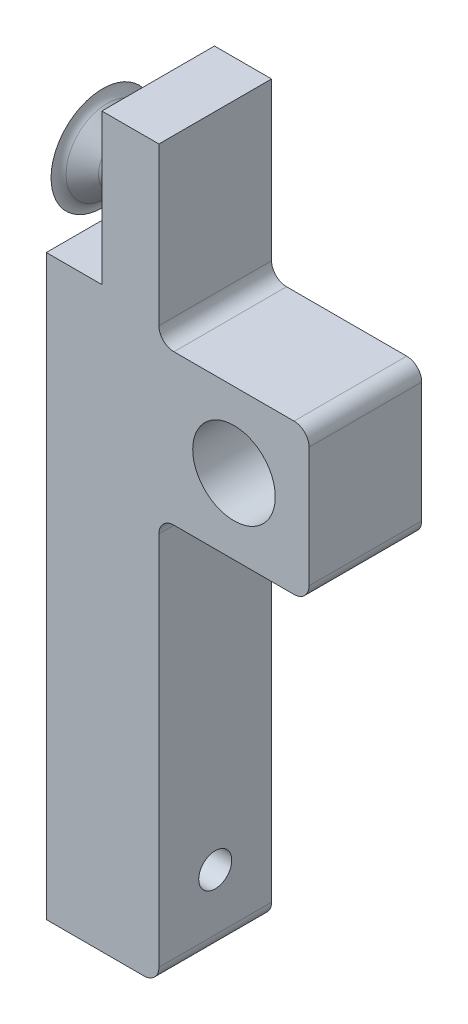
ISO-10303-21;
HEADER;
FILE_DESCRIPTION(('STEP AP214'),'2;1');
FILE_NAME('part.step','',(''),(''),'','','');
FILE_SCHEMA(('AUTOMOTIVE_DESIGN { 1 0 10303 214 1 1 1 1 }'));
ENDSEC;
DATA;
#1=APPLICATION_CONTEXT('core data for automotive mechanical design processes');
#2=APPLICATION_PROTOCOL_DEFINITION('international standard','automotive_design',2000,#1);
#3=PRODUCT_CONTEXT('',#1,'mechanical');
#4=PRODUCT('Part','Part','',(#3));
#5=PRODUCT_RELATED_PRODUCT_CATEGORY('part','',(#4));
#6=PRODUCT_DEFINITION_FORMATION('','',#4);
#7=PRODUCT_DEFINITION_CONTEXT('part definition',#1,'design');
#8=PRODUCT_DEFINITION('design','',#6,#7);
#9=PRODUCT_DEFINITION_SHAPE('','',#8);
#10=(LENGTH_UNIT() NAMED_UNIT(*) SI_UNIT(.MILLI.,.METRE.));
#11=(NAMED_UNIT(*) PLANE_ANGLE_UNIT() SI_UNIT($,.RADIAN.));
#12=(NAMED_UNIT(*) SI_UNIT($,.STERADIAN.) SOLID_ANGLE_UNIT());
#13=UNCERTAINTY_MEASURE_WITH_UNIT(LENGTH_MEASURE(1.E-05),#10,'distance_accuracy_value','');
#14=(GEOMETRIC_REPRESENTATION_CONTEXT(3) GLOBAL_UNCERTAINTY_ASSIGNED_CONTEXT((#13)) GLOBAL_UNIT_ASSIGNED_CONTEXT((#10,
#11,#12)) REPRESENTATION_CONTEXT('',''));
#15=CARTESIAN_POINT('',(0.,0.,0.));
#16=DIRECTION('',(0.,0.,1.));
#17=DIRECTION('',(1.,0.,0.));
#18=AXIS2_PLACEMENT_3D('',#15,#16,#17);
#19=CARTESIAN_POINT('',(-30.0873000000014,-185.773249337691,0.));
#20=DIRECTION('',(0.,1.,0.));
#21=DIRECTION('',(-1.,0.,0.));
#22=AXIS2_PLACEMENT_3D('',#19,#20,#21);
#23=PLANE('',#22);
#24=DIRECTION('',(-1.,0.,0.));
#25=VECTOR('',#24,1.);
#26=CARTESIAN_POINT('',(-30.0873000000014,-185.773249337691,-140.610099631724));
#27=LINE('',#26,#25);
#28=CARTESIAN_POINT('',(-32.6273000000014,-185.773249337691,-140.610099631724));
#29=VERTEX_POINT('',#28);
#30=CARTESIAN_POINT('',(-52.9473000000008,-185.773249337691,-140.610099631724));
#31=VERTEX_POINT('',#30);
#32=EDGE_CURVE('E272',#29,#31,#27,.T.);
#33=ORIENTED_EDGE('',*,*,#32,.T.);
#34=DIRECTION('',(0.,0.,-1.));
#35=VECTOR('',#34,1.);
#36=CARTESIAN_POINT('',(-52.9473000000008,-185.773249337691,0.));
#37=LINE('',#36,#35);
#38=CARTESIAN_POINT('',(-52.9473000000008,-185.773249337691,-121.560099631724));
#39=VERTEX_POINT('',#38);
#40=EDGE_CURVE('E298',#31,#39,#37,.F.);
#41=ORIENTED_EDGE('',*,*,#40,.T.);
#42=DIRECTION('',(-1.,0.,0.));
#43=VECTOR('',#42,1.);
#44=CARTESIAN_POINT('',(-30.0873000000014,-185.773249337691,-121.560099631724));
#45=LINE('',#44,#43);
#46=CARTESIAN_POINT('',(-32.6273000000014,-185.773249337691,-121.560099631724));
#47=VERTEX_POINT('',#46);
#48=EDGE_CURVE('E281',#47,#39,#45,.T.);
#49=ORIENTED_EDGE('',*,*,#48,.F.);
#50=DIRECTION('',(0.,0.,-1.));
#51=VECTOR('',#50,1.);
#52=CARTESIAN_POINT('',(-32.6273000000014,-185.773249337691,0.));
#53=LINE('',#52,#51);
#54=EDGE_CURVE('E295',#47,#29,#53,.T.);
#55=ORIENTED_EDGE('',*,*,#54,.T.);
#56=EDGE_LOOP('',(#33,#41,#49,#55));
#57=FACE_BOUND('',#56,.T.);
#58=ADVANCED_FACE('F38',(#57),#23,.T.);
#59=CARTESIAN_POINT('',(-30.0873000000007,1.07061047337937E-13,0.));
#60=DIRECTION('',(1.,0.,0.));
#61=DIRECTION('',(0.,1.,0.));
#62=AXIS2_PLACEMENT_3D('',#59,#60,#61);
#63=PLANE('',#62);
#64=DIRECTION('',(0.,1.,0.));
#65=VECTOR('',#64,1.);
#66=CARTESIAN_POINT('',(-30.0873000000007,1.07061047337937E-13,-140.610099631724));
#67=LINE('',#66,#65);
#68=CARTESIAN_POINT('',(-30.0873000000015,-208.633249337691,-140.610099631724));
#69=VERTEX_POINT('',#68);
#70=CARTESIAN_POINT('',(-30.0873000000014,-188.313249337691,-140.610099631724));
#71=VERTEX_POINT('',#70);
#72=EDGE_CURVE('E269',#69,#71,#67,.T.);
#73=ORIENTED_EDGE('',*,*,#72,.T.);
#74=DIRECTION('',(0.,0.,-1.));
#75=VECTOR('',#74,1.);
#76=CARTESIAN_POINT('',(-30.0873000000014,-188.313249337691,0.));
#77=LINE('',#76,#75);
#78=CARTESIAN_POINT('',(-30.0873000000014,-188.313249337691,-121.560099631724));
#79=VERTEX_POINT('',#78);
#80=EDGE_CURVE('E307',#71,#79,#77,.F.);
#81=ORIENTED_EDGE('',*,*,#80,.T.);
#82=DIRECTION('',(0.,-1.,0.));
#83=VECTOR('',#82,1.);
#84=CARTESIAN_POINT('',(-30.0873000000007,1.07061047337937E-13,-121.560099631724));
#85=LINE('',#84,#83);
#86=CARTESIAN_POINT('',(-30.0873000000015,-208.633249337691,-121.560099631724));
#87=VERTEX_POINT('',#86);
#88=EDGE_CURVE('E264',#79,#87,#85,.T.);
#89=ORIENTED_EDGE('',*,*,#88,.T.);
#90=DIRECTION('',(0.,0.,-1.));
#91=VECTOR('',#90,1.);
#92=CARTESIAN_POINT('',(-30.0873000000015,-208.633249337691,-140.610099631724));
#93=LINE('',#92,#91);
#94=EDGE_CURVE('E304',#87,#69,#93,.T.);
#95=ORIENTED_EDGE('',*,*,#94,.T.);
#96=EDGE_LOOP('',(#73,#81,#89,#95));
#97=FACE_BOUND('',#96,.T.);
#98=ADVANCED_FACE('F373',(#97),#63,.T.);
#99=CARTESIAN_POINT('',(-30.0873000000015,-211.173249337691,0.));
#100=DIRECTION('',(0.,1.,0.));
#101=DIRECTION('',(-1.,0.,0.));
#102=AXIS2_PLACEMENT_3D('',#99,#100,#101);
#103=PLANE('',#102);
#104=DIRECTION('',(-1.,0.,0.));
#105=VECTOR('',#104,1.);
#106=CARTESIAN_POINT('',(-30.0873000000015,-211.173249337691,-140.610099631724));
#107=LINE('',#106,#105);
#108=CARTESIAN_POINT('',(-32.6273000000015,-211.173249337691,-140.610099631724));
#109=VERTEX_POINT('',#108);
#110=CARTESIAN_POINT('',(-52.9473000000008,-211.173249337691,-140.610099631724));
#111=VERTEX_POINT('',#110);
#112=EDGE_CURVE('E275',#109,#111,#107,.T.);
#113=ORIENTED_EDGE('',*,*,#112,.F.);
#114=DIRECTION('',(0.,0.,-1.));
#115=VECTOR('',#114,1.);
#116=CARTESIAN_POINT('',(-32.6273000000015,-211.173249337691,-121.560099631724));
#117=LINE('',#116,#115);
#118=CARTESIAN_POINT('',(-32.6273000000015,-211.173249337691,-121.560099631724));
#119=VERTEX_POINT('',#118);
#120=EDGE_CURVE('E316',#109,#119,#117,.F.);
#121=ORIENTED_EDGE('',*,*,#120,.T.);
#122=DIRECTION('',(-1.,0.,0.));
#123=VECTOR('',#122,1.);
#124=CARTESIAN_POINT('',(-30.0873000000015,-211.173249337691,-121.560099631724));
#125=LINE('',#124,#123);
#126=CARTESIAN_POINT('',(-52.9473000000008,-211.173249337691,-121.560099631724));
#127=VERTEX_POINT('',#126);
#128=EDGE_CURVE('E278',#119,#127,#125,.T.);
#129=ORIENTED_EDGE('',*,*,#128,.T.);
#130=DIRECTION('',(0.,0.,-1.));
#131=VECTOR('',#130,1.);
#132=CARTESIAN_POINT('',(-52.9473000000008,-211.173249337691,-140.610099631724));
#133=LINE('',#132,#131);
#134=EDGE_CURVE('E313',#127,#111,#133,.T.);
#135=ORIENTED_EDGE('',*,*,#134,.T.);
#136=EDGE_LOOP('',(#113,#121,#129,#135));
#137=FACE_BOUND('',#136,.T.);
#138=ADVANCED_FACE('F381',(#137),#103,.F.);
#139=CARTESIAN_POINT('',(-55.4873000000007,0.,-140.610099631724));
#140=DIRECTION('',(-1.,0.,0.));
#141=DIRECTION('',(0.,-1.,0.));
#142=AXIS2_PLACEMENT_3D('',#139,#140,#141);
#143=PLANE('',#142);
#144=CARTESIAN_POINT('',(-55.4873000000008,-267.688249337691,-131.085099631724));
#145=DIRECTION('',(-1.,0.,0.));
#146=DIRECTION('',(0.,-1.,0.));
#147=AXIS2_PLACEMENT_3D('',#144,#145,#146);
#148=CIRCLE('',#147,2.79399999999998);
#149=CARTESIAN_POINT('',(-55.4873000000008,-270.482249337691,-131.085099631724));
#150=VERTEX_POINT('',#149);
#151=EDGE_CURVE('E190',#150,#150,#148,.T.);
#152=ORIENTED_EDGE('',*,*,#151,.T.);
#153=EDGE_LOOP('',(#152));
#154=FACE_BOUND('',#153,.T.);
#155=DIRECTION('',(0.,-1.,0.));
#156=VECTOR('',#155,1.);
#157=CARTESIAN_POINT('',(-55.4873000000007,0.,-121.560099631724));
#158=LINE('',#157,#156);
#159=CARTESIAN_POINT('',(-55.4873000000008,-213.713249337691,-121.560099631724));
#160=VERTEX_POINT('',#159);
#161=CARTESIAN_POINT('',(-55.4873000000008,-277.213249337691,-121.560099631724));
#162=VERTEX_POINT('',#161);
#163=EDGE_CURVE('E290',#160,#162,#158,.T.);
#164=ORIENTED_EDGE('',*,*,#163,.T.);
#165=DIRECTION('',(0.,0.,1.));
#166=VECTOR('',#165,1.);
#167=CARTESIAN_POINT('',(-55.4873000000008,-277.213249337691,-140.610099631724));
#168=LINE('',#167,#166);
#169=CARTESIAN_POINT('',(-55.4873000000008,-277.213249337691,-140.610099631724));
#170=VERTEX_POINT('',#169);
#171=EDGE_CURVE('E46',#162,#170,#168,.F.);
#172=ORIENTED_EDGE('',*,*,#171,.T.);
#173=DIRECTION('',(0.,-1.,0.));
#174=VECTOR('',#173,1.);
#175=CARTESIAN_POINT('',(-55.4873000000007,0.,-140.610099631724));
#176=LINE('',#175,#174);
#177=CARTESIAN_POINT('',(-55.4873000000008,-213.713249337691,-140.610099631724));
#178=VERTEX_POINT('',#177);
#179=EDGE_CURVE('E178',#178,#170,#176,.T.);
#180=ORIENTED_EDGE('',*,*,#179,.F.);
#181=DIRECTION('',(0.,0.,-1.));
#182=VECTOR('',#181,1.);
#183=CARTESIAN_POINT('',(-55.4873000000008,-213.713249337691,-121.560099631724));
#184=LINE('',#183,#182);
#185=EDGE_CURVE('E318',#178,#160,#184,.F.);
#186=ORIENTED_EDGE('',*,*,#185,.T.);
#187=EDGE_LOOP('',(#164,#172,#180,#186));
#188=FACE_BOUND('',#187,.T.);
#189=ADVANCED_FACE('F388',(#154,#188),#143,.F.);
#190=CARTESIAN_POINT('',(-42.7873000000013,-198.473249337691,-121.560099631724));
#191=DIRECTION('',(0.,0.,-1.));
#192=DIRECTION('',(-1.,0.,0.));
#193=AXIS2_PLACEMENT_3D('',#190,#191,#192);
#194=CYLINDRICAL_SURFACE('',#193,6.985);
#195=CARTESIAN_POINT('',(-42.7873000000013,-198.473249337691,-121.560099631724));
#196=DIRECTION('',(0.,0.,-1.));
#197=DIRECTION('',(-1.,0.,0.));
#198=AXIS2_PLACEMENT_3D('',#195,#196,#197);
#199=CIRCLE('',#198,6.985);
#200=CARTESIAN_POINT('',(-49.7723000000013,-198.473249337691,-121.560099631724));
#201=VERTEX_POINT('',#200);
#202=EDGE_CURVE('E261',#201,#201,#199,.T.);
#203=CARTESIAN_POINT('',(-42.7873000000013,-198.473249337691,-140.610099631724));
#204=DIRECTION('',(0.,0.,-1.));
#205=DIRECTION('',(-1.,0.,0.));
#206=AXIS2_PLACEMENT_3D('',#203,#204,#205);
#207=CIRCLE('',#206,6.985);
#208=CARTESIAN_POINT('',(-49.7723000000013,-198.473249337691,-140.610099631724));
#209=VERTEX_POINT('',#208);
#210=EDGE_CURVE('E247',#209,#209,#207,.T.);
#211=CARTESIAN_POINT('',(-49.7723000000013,-198.473249337691,-121.560099631724));
#212=CARTESIAN_POINT('',(-49.7723000000013,-198.473249337691,-121.758537131724));
#213=CARTESIAN_POINT('',(-49.7723000000013,-198.473249337691,-121.956974631724));
#214=CARTESIAN_POINT('',(-49.7723000000013,-198.473249337691,-122.353849631724));
#215=CARTESIAN_POINT('',(-49.7723000000013,-198.473249337691,-122.552287131724));
#216=CARTESIAN_POINT('',(-49.7723000000013,-198.473249337691,-122.949162131724));
#217=CARTESIAN_POINT('',(-49.7723000000013,-198.473249337691,-123.147599631724));
#218=CARTESIAN_POINT('',(-49.7723000000013,-198.473249337691,-123.544474631724));
#219=CARTESIAN_POINT('',(-49.7723000000013,-198.473249337691,-123.742912131724));
#220=CARTESIAN_POINT('',(-49.7723000000013,-198.473249337691,-124.139787131724));
#221=CARTESIAN_POINT('',(-49.7723000000013,-198.473249337691,-124.338224631724));
#222=CARTESIAN_POINT('',(-49.7723000000013,-198.473249337691,-124.735099631724));
#223=CARTESIAN_POINT('',(-49.7723000000013,-198.473249337691,-124.933537131724));
#224=CARTESIAN_POINT('',(-49.7723000000013,-198.473249337691,-125.330412131724));
#225=CARTESIAN_POINT('',(-49.7723000000013,-198.473249337691,-125.528849631724));
#226=CARTESIAN_POINT('',(-49.7723000000013,-198.473249337691,-125.925724631724));
#227=CARTESIAN_POINT('',(-49.7723000000013,-198.473249337691,-126.124162131724));
#228=CARTESIAN_POINT('',(-49.7723000000013,-198.473249337691,-126.521037131724));
#229=CARTESIAN_POINT('',(-49.7723000000013,-198.473249337691,-126.719474631724));
#230=CARTESIAN_POINT('',(-49.7723000000013,-198.473249337691,-127.116349631724));
#231=CARTESIAN_POINT('',(-49.7723000000013,-198.473249337691,-127.314787131724));
#232=CARTESIAN_POINT('',(-49.7723000000013,-198.473249337691,-127.711662131724));
#233=CARTESIAN_POINT('',(-49.7723000000013,-198.473249337691,-127.910099631724));
#234=CARTESIAN_POINT('',(-49.7723000000013,-198.473249337691,-128.306974631724));
#235=CARTESIAN_POINT('',(-49.7723000000013,-198.473249337691,-128.505412131724));
#236=CARTESIAN_POINT('',(-49.7723000000013,-198.473249337691,-128.902287131724));
#237=CARTESIAN_POINT('',(-49.7723000000013,-198.473249337691,-129.100724631723));
#238=CARTESIAN_POINT('',(-49.7723000000013,-198.473249337691,-129.497599631724));
#239=CARTESIAN_POINT('',(-49.7723000000013,-198.473249337691,-129.696037131724));
#240=CARTESIAN_POINT('',(-49.7723000000013,-198.473249337691,-130.092912131724));
#241=CARTESIAN_POINT('',(-49.7723000000013,-198.473249337691,-130.291349631724));
#242=CARTESIAN_POINT('',(-49.7723000000013,-198.473249337691,-130.688224631724));
#243=CARTESIAN_POINT('',(-49.7723000000013,-198.473249337691,-130.886662131724));
#244=CARTESIAN_POINT('',(-49.7723000000013,-198.473249337691,-131.283537131724));
#245=CARTESIAN_POINT('',(-49.7723000000013,-198.473249337691,-131.481974631724));
#246=CARTESIAN_POINT('',(-49.7723000000013,-198.473249337691,-131.878849631724));
#247=CARTESIAN_POINT('',(-49.7723000000013,-198.473249337691,-132.077287131723));
#248=CARTESIAN_POINT('',(-49.7723000000013,-198.473249337691,-132.474162131724));
#249=CARTESIAN_POINT('',(-49.7723000000013,-198.473249337691,-132.672599631724));
#250=CARTESIAN_POINT('',(-49.7723000000013,-198.473249337691,-133.069474631724));
#251=CARTESIAN_POINT('',(-49.7723000000013,-198.473249337691,-133.267912131724));
#252=CARTESIAN_POINT('',(-49.7723000000013,-198.473249337691,-133.664787131724));
#253=CARTESIAN_POINT('',(-49.7723000000013,-198.473249337691,-133.863224631724));
#254=CARTESIAN_POINT('',(-49.7723000000013,-198.473249337691,-134.260099631724));
#255=CARTESIAN_POINT('',(-49.7723000000013,-198.473249337691,-134.458537131724));
#256=CARTESIAN_POINT('',(-49.7723000000013,-198.473249337691,-134.855412131724));
#257=CARTESIAN_POINT('',(-49.7723000000013,-198.473249337691,-135.053849631724));
#258=CARTESIAN_POINT('',(-49.7723000000013,-198.473249337691,-135.450724631724));
#259=CARTESIAN_POINT('',(-49.7723000000013,-198.473249337691,-135.649162131724));
#260=CARTESIAN_POINT('',(-49.7723000000013,-198.473249337691,-136.046037131724));
#261=CARTESIAN_POINT('',(-49.7723000000013,-198.473249337691,-136.244474631724));
#262=CARTESIAN_POINT('',(-49.7723000000013,-198.473249337691,-136.641349631724));
#263=CARTESIAN_POINT('',(-49.7723000000013,-198.473249337691,-136.839787131724));
#264=CARTESIAN_POINT('',(-49.7723000000013,-198.473249337691,-137.236662131724));
#265=CARTESIAN_POINT('',(-49.7723000000013,-198.473249337691,-137.435099631724));
#266=CARTESIAN_POINT('',(-49.7723000000013,-198.473249337691,-137.831974631724));
#267=CARTESIAN_POINT('',(-49.7723000000013,-198.473249337691,-138.030412131724));
#268=CARTESIAN_POINT('',(-49.7723000000013,-198.473249337691,-138.427287131724));
#269=CARTESIAN_POINT('',(-49.7723000000013,-198.473249337691,-138.625724631724));
#270=CARTESIAN_POINT('',(-49.7723000000013,-198.473249337691,-139.022599631724));
#271=CARTESIAN_POINT('',(-49.7723000000013,-198.473249337691,-139.221037131724));
#272=CARTESIAN_POINT('',(-49.7723000000013,-198.473249337691,-139.617912131724));
#273=CARTESIAN_POINT('',(-49.7723000000013,-198.473249337691,-139.816349631724));
#274=CARTESIAN_POINT('',(-49.7723000000013,-198.473249337691,-140.213224631724));
#275=CARTESIAN_POINT('',(-49.7723000000013,-198.473249337691,-140.411662131724));
#276=CARTESIAN_POINT('',(-49.7723000000013,-198.473249337691,-140.610099631724));
#277=B_SPLINE_CURVE_WITH_KNOTS('',3,(#211,#212,#213,#214,#215,#216,#217,#218,#219,#220,#221,
#222,#223,#224,#225,#226,#227,#228,#229,#230,#231,#232,#233,#234,#235,#236,#237,#238,#239,#240,
#241,#242,#243,#244,#245,#246,#247,#248,#249,#250,#251,#252,#253,#254,#255,#256,#257,#258,#259,
#260,#261,#262,#263,#264,#265,#266,#267,#268,#269,#270,#271,#272,#273,#274,#275,#276),
.UNSPECIFIED.,.F.,.F.,(4,2,2,2,2,2,2,2,2,2,2,2,2,2,2,2,2,2,2,2,2,2,2,2,2,2,2,2,2,2,2,2,4),(0.,
0.595312499999986,1.19062499999999,1.78593749999999,2.38124999999999,2.97656249999999,
3.57187499999999,4.16718749999999,4.76249999999999,5.35781249999999,5.95312499999999,
6.54843749999999,7.14374999999999,7.73906249999999,8.33437499999999,8.92968749999999,
9.52499999999999,10.1203125,10.715625,11.3109375,11.90625,12.5015625,13.096875,13.6921875,
14.2875,14.8828125,15.478125,16.0734375,16.66875,17.2640625,17.859375,18.4546875,19.05),.UNSPECIFIED.);
#278=EDGE_CURVE('BSEAM408',#201,#209,#277,.T.);
#279=ORIENTED_EDGE('',*,*,#202,.F.);
#280=ORIENTED_EDGE('',*,*,#210,.T.);
#281=ORIENTED_EDGE('',*,*,#278,.T.);
#282=ORIENTED_EDGE('',*,*,#278,.F.);
#283=EDGE_LOOP('',(#279,#281,#280,#282));
#284=FACE_BOUND('',#283,.T.);
#285=ADVANCED_FACE('F408',(#284),#194,.F.);
#286=CARTESIAN_POINT('',(0.,0.,-121.560099631724));
#287=DIRECTION('',(0.,0.,-1.));
#288=DIRECTION('',(-1.,0.,0.));
#289=AXIS2_PLACEMENT_3D('',#286,#287,#288);
#290=PLANE('',#289);
#291=ORIENTED_EDGE('',*,*,#202,.T.);
#292=EDGE_LOOP('',(#291));
#293=FACE_BOUND('',#292,.T.);
#294=DIRECTION('',(-1.,0.,0.));
#295=VECTOR('',#294,1.);
#296=CARTESIAN_POINT('',(0.,-182.026627993844,-121.560099631724));
#297=LINE('',#296,#295);
#298=CARTESIAN_POINT('',(-71.9973000000008,-182.026627993844,-121.560099631724));
#299=VERTEX_POINT('',#298);
#300=CARTESIAN_POINT('',(-74.5373000000008,-182.026627993844,-121.560099631724));
#301=VERTEX_POINT('',#300);
#302=EDGE_CURVE('E204',#299,#301,#297,.T.);
#303=ORIENTED_EDGE('',*,*,#302,.T.);
#304=DIRECTION('',(0.,-1.,0.));
#305=VECTOR('',#304,1.);
#306=CARTESIAN_POINT('',(-74.5373,2.6346356941029E-13,-121.560099631724));
#307=LINE('',#306,#305);
#308=CARTESIAN_POINT('',(-74.5373000000008,-279.753249337691,-121.560099631724));
#309=VERTEX_POINT('',#308);
#310=EDGE_CURVE('E283',#301,#309,#307,.T.);
#311=ORIENTED_EDGE('',*,*,#310,.T.);
#312=DIRECTION('',(-1.,0.,0.));
#313=VECTOR('',#312,1.);
#314=CARTESIAN_POINT('',(-71.9973000000007,-279.753249337691,-121.560099631724));
#315=LINE('',#314,#313);
#316=CARTESIAN_POINT('',(-58.0273000000008,-279.753249337691,-121.560099631724));
#317=VERTEX_POINT('',#316);
#318=EDGE_CURVE('E189',#317,#309,#315,.T.);
#319=ORIENTED_EDGE('',*,*,#318,.F.);
#320=CARTESIAN_POINT('',(-58.0273000000008,-277.213249337691,-121.560099631724));
#321=DIRECTION('',(0.,0.,-1.));
#322=DIRECTION('',(-1.,0.,0.));
#323=AXIS2_PLACEMENT_3D('',#320,#321,#322);
#324=CIRCLE('',#323,2.54);
#325=EDGE_CURVE('E60',#317,#162,#324,.F.);
#326=ORIENTED_EDGE('',*,*,#325,.T.);
#327=ORIENTED_EDGE('',*,*,#163,.F.);
#328=CARTESIAN_POINT('',(-52.9473000000008,-213.713249337691,-121.560099631724));
#329=DIRECTION('',(0.,0.,-1.));
#330=DIRECTION('',(-1.,0.,0.));
#331=AXIS2_PLACEMENT_3D('',#328,#329,#330);
#332=CIRCLE('',#331,2.54);
#333=EDGE_CURVE('E326',#160,#127,#332,.T.);
#334=ORIENTED_EDGE('',*,*,#333,.T.);
#335=ORIENTED_EDGE('',*,*,#128,.F.);
#336=CARTESIAN_POINT('',(-32.6273000000015,-208.633249337691,-121.560099631724));
#337=DIRECTION('',(0.,0.,-1.));
#338=DIRECTION('',(-1.,0.,0.));
#339=AXIS2_PLACEMENT_3D('',#336,#337,#338);
#340=CIRCLE('',#339,2.54);
#341=EDGE_CURVE('E309',#119,#87,#340,.F.);
#342=ORIENTED_EDGE('',*,*,#341,.T.);
#343=ORIENTED_EDGE('',*,*,#88,.F.);
#344=CARTESIAN_POINT('',(-32.6273000000014,-188.313249337691,-121.560099631724));
#345=DIRECTION('',(0.,0.,-1.));
#346=DIRECTION('',(-1.,0.,0.));
#347=AXIS2_PLACEMENT_3D('',#344,#345,#346);
#348=CIRCLE('',#347,2.54);
#349=EDGE_CURVE('E311',#79,#47,#348,.F.);
#350=ORIENTED_EDGE('',*,*,#349,.T.);
#351=ORIENTED_EDGE('',*,*,#48,.T.);
#352=CARTESIAN_POINT('',(-52.9473000000008,-183.233249337691,-121.560099631724));
#353=DIRECTION('',(0.,0.,-1.));
#354=DIRECTION('',(-1.,0.,0.));
#355=AXIS2_PLACEMENT_3D('',#352,#353,#354);
#356=CIRCLE('',#355,2.54);
#357=CARTESIAN_POINT('',(-55.4873000000008,-183.233249337691,-121.560099631724));
#358=VERTEX_POINT('',#357);
#359=EDGE_CURVE('E322',#39,#358,#356,.T.);
#360=ORIENTED_EDGE('',*,*,#359,.T.);
#361=CARTESIAN_POINT('',(-55.4873000000008,-156.603627993844,-121.560099631724));
#362=VERTEX_POINT('',#361);
#363=EDGE_CURVE('E179',#362,#358,#158,.T.);
#364=ORIENTED_EDGE('',*,*,#363,.F.);
#365=DIRECTION('',(1.,0.,0.));
#366=VECTOR('',#365,1.);
#367=CARTESIAN_POINT('',(-55.4873000000008,-156.603627993844,-121.560099631724));
#368=LINE('',#367,#366);
#369=CARTESIAN_POINT('',(-58.0273000000008,-156.603627993844,-121.560099631724));
#370=VERTEX_POINT('',#369);
#371=EDGE_CURVE('E223',#370,#362,#368,.T.);
#372=ORIENTED_EDGE('',*,*,#371,.F.);
#373=DIRECTION('',(1.,0.,0.));
#374=VECTOR('',#373,1.);
#375=CARTESIAN_POINT('',(-58.0273000000008,-156.603627993844,-121.560099631724));
#376=LINE('',#375,#374);
#377=CARTESIAN_POINT('',(-65.1393000000009,-156.603627993844,-121.560099631724));
#378=VERTEX_POINT('',#377);
#379=EDGE_CURVE('E226',#378,#370,#376,.T.);
#380=ORIENTED_EDGE('',*,*,#379,.F.);
#381=DIRECTION('',(0.,1.,0.));
#382=VECTOR('',#381,1.);
#383=CARTESIAN_POINT('',(-65.1393000000009,5.38680000000011,-121.560099631724));
#384=LINE('',#383,#382);
#385=CARTESIAN_POINT('',(-65.1393000000009,-182.026627993844,-121.560099631724));
#386=VERTEX_POINT('',#385);
#387=EDGE_CURVE('E229',#386,#378,#384,.T.);
#388=ORIENTED_EDGE('',*,*,#387,.F.);
#389=EDGE_CURVE('E202',#386,#299,#297,.T.);
#390=ORIENTED_EDGE('',*,*,#389,.T.);
#391=EDGE_LOOP('',(#303,#311,#319,#326,#327,#334,#335,#342,#343,#350,#351,#360,#364,#372,#380,
#388,#390));
#392=FACE_BOUND('',#391,.T.);
#393=ADVANCED_FACE('F334',(#293,#392),#290,.F.);
#394=CARTESIAN_POINT('',(0.,0.,-140.610099631724));
#395=DIRECTION('',(0.,0.,-1.));
#396=DIRECTION('',(-1.,0.,0.));
#397=AXIS2_PLACEMENT_3D('',#394,#395,#396);
#398=PLANE('',#397);
#399=DIRECTION('',(-1.,0.,0.));
#400=VECTOR('',#399,1.);
#401=CARTESIAN_POINT('',(0.,-156.603627993844,-140.610099631724));
#402=LINE('',#401,#400);
#403=CARTESIAN_POINT('',(-55.4873000000008,-156.603627993844,-140.610099631724));
#404=VERTEX_POINT('',#403);
#405=CARTESIAN_POINT('',(-58.0273000000008,-156.603627993844,-140.610099631724));
#406=VERTEX_POINT('',#405);
#407=EDGE_CURVE('E210',#404,#406,#402,.T.);
#408=ORIENTED_EDGE('',*,*,#407,.F.);
#409=CARTESIAN_POINT('',(-55.4873000000008,-183.233249337691,-140.610099631724));
#410=VERTEX_POINT('',#409);
#411=EDGE_CURVE('E285',#404,#410,#176,.T.);
#412=ORIENTED_EDGE('',*,*,#411,.T.);
#413=CARTESIAN_POINT('',(-52.9473000000008,-183.233249337691,-140.610099631724));
#414=DIRECTION('',(0.,0.,-1.));
#415=DIRECTION('',(-1.,0.,0.));
#416=AXIS2_PLACEMENT_3D('',#413,#414,#415);
#417=CIRCLE('',#416,2.54);
#418=EDGE_CURVE('E320',#410,#31,#417,.F.);
#419=ORIENTED_EDGE('',*,*,#418,.T.);
#420=ORIENTED_EDGE('',*,*,#32,.F.);
#421=CARTESIAN_POINT('',(-32.6273000000014,-188.313249337691,-140.610099631724));
#422=DIRECTION('',(0.,0.,-1.));
#423=DIRECTION('',(-1.,0.,0.));
#424=AXIS2_PLACEMENT_3D('',#421,#422,#423);
#425=CIRCLE('',#424,2.54);
#426=EDGE_CURVE('E302',#29,#71,#425,.T.);
#427=ORIENTED_EDGE('',*,*,#426,.T.);
#428=ORIENTED_EDGE('',*,*,#72,.F.);
#429=CARTESIAN_POINT('',(-32.6273000000015,-208.633249337691,-140.610099631724));
#430=DIRECTION('',(0.,0.,-1.));
#431=DIRECTION('',(-1.,0.,0.));
#432=AXIS2_PLACEMENT_3D('',#429,#430,#431);
#433=CIRCLE('',#432,2.54);
#434=EDGE_CURVE('E300',#69,#109,#433,.T.);
#435=ORIENTED_EDGE('',*,*,#434,.T.);
#436=ORIENTED_EDGE('',*,*,#112,.T.);
#437=CARTESIAN_POINT('',(-52.9473000000008,-213.713249337691,-140.610099631724));
#438=DIRECTION('',(0.,0.,-1.));
#439=DIRECTION('',(-1.,0.,0.));
#440=AXIS2_PLACEMENT_3D('',#437,#438,#439);
#441=CIRCLE('',#440,2.54);
#442=EDGE_CURVE('E324',#111,#178,#441,.F.);
#443=ORIENTED_EDGE('',*,*,#442,.T.);
#444=ORIENTED_EDGE('',*,*,#179,.T.);
#445=CARTESIAN_POINT('',(-58.0273000000008,-277.213249337691,-140.610099631724));
#446=DIRECTION('',(0.,0.,-1.));
#447=DIRECTION('',(-1.,0.,0.));
#448=AXIS2_PLACEMENT_3D('',#445,#446,#447);
#449=CIRCLE('',#448,2.54);
#450=CARTESIAN_POINT('',(-58.0273000000008,-279.753249337691,-140.610099631724));
#451=VERTEX_POINT('',#450);
#452=EDGE_CURVE('E11',#170,#451,#449,.T.);
#453=ORIENTED_EDGE('',*,*,#452,.T.);
#454=DIRECTION('',(1.,0.,0.));
#455=VECTOR('',#454,1.);
#456=CARTESIAN_POINT('',(-74.5373000000007,-279.753249337691,-140.610099631724));
#457=LINE('',#456,#455);
#458=CARTESIAN_POINT('',(-74.5373000000008,-279.753249337691,-140.610099631724));
#459=VERTEX_POINT('',#458);
#460=EDGE_CURVE('E182',#459,#451,#457,.T.);
#461=ORIENTED_EDGE('',*,*,#460,.F.);
#462=DIRECTION('',(0.,-1.,0.));
#463=VECTOR('',#462,1.);
#464=CARTESIAN_POINT('',(-74.5373,2.6346356941029E-13,-140.610099631724));
#465=LINE('',#464,#463);
#466=CARTESIAN_POINT('',(-74.5373000000008,-182.026627993844,-140.610099631724));
#467=VERTEX_POINT('',#466);
#468=EDGE_CURVE('E169',#467,#459,#465,.T.);
#469=ORIENTED_EDGE('',*,*,#468,.F.);
#470=DIRECTION('',(-1.,0.,0.));
#471=VECTOR('',#470,1.);
#472=CARTESIAN_POINT('',(0.,-182.026627993844,-140.610099631724));
#473=LINE('',#472,#471);
#474=CARTESIAN_POINT('',(-71.9973000000008,-182.026627993844,-140.610099631724));
#475=VERTEX_POINT('',#474);
#476=EDGE_CURVE('E215',#475,#467,#473,.T.);
#477=ORIENTED_EDGE('',*,*,#476,.F.);
#478=CARTESIAN_POINT('',(-65.1393000000009,-182.026627993844,-140.610099631724));
#479=VERTEX_POINT('',#478);
#480=EDGE_CURVE('E218',#479,#475,#473,.T.);
#481=ORIENTED_EDGE('',*,*,#480,.F.);
#482=DIRECTION('',(0.,-1.,0.));
#483=VECTOR('',#482,1.);
#484=CARTESIAN_POINT('',(-65.1393000000009,5.38680000000011,-140.610099631724));
#485=LINE('',#484,#483);
#486=CARTESIAN_POINT('',(-65.1393000000009,-156.603627993844,-140.610099631724));
#487=VERTEX_POINT('',#486);
#488=EDGE_CURVE('E213',#487,#479,#485,.T.);
#489=ORIENTED_EDGE('',*,*,#488,.F.);
#490=EDGE_CURVE('E205',#406,#487,#402,.T.);
#491=ORIENTED_EDGE('',*,*,#490,.F.);
#492=EDGE_LOOP('',(#408,#412,#419,#420,#427,#428,#435,#436,#443,#444,#453,#461,#469,#477,#481,
#489,#491));
#493=FACE_BOUND('',#492,.T.);
#494=ORIENTED_EDGE('',*,*,#210,.F.);
#495=EDGE_LOOP('',(#494));
#496=FACE_BOUND('',#495,.T.);
#497=ADVANCED_FACE('F183',(#493,#496),#398,.T.);
#498=ORIENTED_EDGE('',*,*,#363,.T.);
#499=DIRECTION('',(0.,0.,-1.));
#500=VECTOR('',#499,1.);
#501=CARTESIAN_POINT('',(-55.4873000000008,-183.233249337691,-140.610099631724));
#502=LINE('',#501,#500);
#503=EDGE_CURVE('E288',#358,#410,#502,.T.);
#504=ORIENTED_EDGE('',*,*,#503,.T.);
#505=ORIENTED_EDGE('',*,*,#411,.F.);
#506=DIRECTION('',(0.,0.,-1.));
#507=VECTOR('',#506,1.);
#508=CARTESIAN_POINT('',(-55.4873000000008,-156.603627993844,-140.610099631724));
#509=LINE('',#508,#507);
#510=EDGE_CURVE('E214',#362,#404,#509,.T.);
#511=ORIENTED_EDGE('',*,*,#510,.F.);
#512=EDGE_LOOP('',(#498,#504,#505,#511));
#513=FACE_BOUND('',#512,.T.);
#514=ADVANCED_FACE('F356',(#513),#143,.F.);
#515=CARTESIAN_POINT('',(-74.5373,2.6346356941029E-13,-140.610099631724));
#516=DIRECTION('',(-1.,0.,0.));
#517=DIRECTION('',(0.,-1.,0.));
#518=AXIS2_PLACEMENT_3D('',#515,#516,#517);
#519=PLANE('',#518);
#520=CARTESIAN_POINT('',(-74.5373000000009,-267.688249337691,-131.085099631724));
#521=DIRECTION('',(-1.,0.,0.));
#522=DIRECTION('',(0.,-1.,0.));
#523=AXIS2_PLACEMENT_3D('',#520,#521,#522);
#524=CIRCLE('',#523,2.79399999999998);
#525=CARTESIAN_POINT('',(-74.5373000000009,-270.482249337691,-131.085099631724));
#526=VERTEX_POINT('',#525);
#527=EDGE_CURVE('E329',#526,#526,#524,.T.);
#528=ORIENTED_EDGE('',*,*,#527,.F.);
#529=EDGE_LOOP('',(#528));
#530=FACE_BOUND('',#529,.T.);
#531=ORIENTED_EDGE('',*,*,#310,.F.);
#532=DIRECTION('',(0.,0.,1.));
#533=VECTOR('',#532,1.);
#534=CARTESIAN_POINT('',(-74.5373000000008,-182.026627993844,-121.560099631724));
#535=LINE('',#534,#533);
#536=EDGE_CURVE('E175',#467,#301,#535,.T.);
#537=ORIENTED_EDGE('',*,*,#536,.F.);
#538=ORIENTED_EDGE('',*,*,#468,.T.);
#539=DIRECTION('',(0.,0.,-1.));
#540=VECTOR('',#539,1.);
#541=CARTESIAN_POINT('',(-74.5373000000008,-279.753249337691,-121.560099631724));
#542=LINE('',#541,#540);
#543=EDGE_CURVE('E173',#309,#459,#542,.T.);
#544=ORIENTED_EDGE('',*,*,#543,.F.);
#545=EDGE_LOOP('',(#531,#537,#538,#544));
#546=FACE_BOUND('',#545,.T.);
#547=ADVANCED_FACE('F171',(#530,#546),#519,.T.);
#548=CARTESIAN_POINT('',(-52.9473000000008,-183.233249337691,-140.610099631724));
#549=DIRECTION('',(0.,0.,-1.));
#550=DIRECTION('',(0.,1.,0.));
#551=AXIS2_PLACEMENT_3D('',#548,#549,#550);
#552=CYLINDRICAL_SURFACE('',#551,2.54);
#553=ORIENTED_EDGE('',*,*,#359,.F.);
#554=ORIENTED_EDGE('',*,*,#40,.F.);
#555=ORIENTED_EDGE('',*,*,#418,.F.);
#556=ORIENTED_EDGE('',*,*,#503,.F.);
#557=EDGE_LOOP('',(#553,#554,#555,#556));
#558=FACE_BOUND('',#557,.T.);
#559=ADVANCED_FACE('F361',(#558),#552,.F.);
#560=CARTESIAN_POINT('',(-32.6273000000014,-188.313249337691,0.));
#561=DIRECTION('',(0.,0.,-1.));
#562=DIRECTION('',(-1.,0.,0.));
#563=AXIS2_PLACEMENT_3D('',#560,#561,#562);
#564=CYLINDRICAL_SURFACE('',#563,2.54);
#565=ORIENTED_EDGE('',*,*,#349,.F.);
#566=ORIENTED_EDGE('',*,*,#80,.F.);
#567=ORIENTED_EDGE('',*,*,#426,.F.);
#568=ORIENTED_EDGE('',*,*,#54,.F.);
#569=EDGE_LOOP('',(#565,#566,#567,#568));
#570=FACE_BOUND('',#569,.T.);
#571=ADVANCED_FACE('F370',(#570),#564,.T.);
#572=CARTESIAN_POINT('',(-32.6273000000015,-208.633249337691,0.));
#573=DIRECTION('',(0.,0.,1.));
#574=DIRECTION('',(1.,0.,0.));
#575=AXIS2_PLACEMENT_3D('',#572,#573,#574);
#576=CYLINDRICAL_SURFACE('',#575,2.54);
#577=ORIENTED_EDGE('',*,*,#341,.F.);
#578=ORIENTED_EDGE('',*,*,#120,.F.);
#579=ORIENTED_EDGE('',*,*,#434,.F.);
#580=ORIENTED_EDGE('',*,*,#94,.F.);
#581=EDGE_LOOP('',(#577,#578,#579,#580));
#582=FACE_BOUND('',#581,.T.);
#583=ADVANCED_FACE('F377',(#582),#576,.T.);
#584=CARTESIAN_POINT('',(-52.9473000000008,-213.713249337691,0.));
#585=DIRECTION('',(0.,0.,1.));
#586=DIRECTION('',(0.,-1.,0.));
#587=AXIS2_PLACEMENT_3D('',#584,#585,#586);
#588=CYLINDRICAL_SURFACE('',#587,2.54);
#589=ORIENTED_EDGE('',*,*,#333,.F.);
#590=ORIENTED_EDGE('',*,*,#185,.F.);
#591=ORIENTED_EDGE('',*,*,#442,.F.);
#592=ORIENTED_EDGE('',*,*,#134,.F.);
#593=EDGE_LOOP('',(#589,#590,#591,#592));
#594=FACE_BOUND('',#593,.T.);
#595=ADVANCED_FACE('F386',(#594),#588,.F.);
#596=CARTESIAN_POINT('',(-74.5373000000008,5.38680000000011,-121.560099631724));
#597=DIRECTION('',(-1.,0.,0.));
#598=DIRECTION('',(0.,0.,1.));
#599=AXIS2_PLACEMENT_3D('',#596,#597,#598);
#600=PLANE('',#599);
#601=CARTESIAN_POINT('',(-74.5373000000008,-171.508627993844,-131.085099631724));
#602=DIRECTION('',(-1.,0.,0.));
#603=DIRECTION('',(0.,-1.,0.));
#604=AXIS2_PLACEMENT_3D('',#601,#602,#603);
#605=CIRCLE('',#604,8.71723050896253);
#606=CARTESIAN_POINT('',(-74.5373000000009,-180.225858502806,-131.085099631724));
#607=VERTEX_POINT('',#606);
#608=EDGE_CURVE('E206',#607,#607,#605,.T.);
#609=ORIENTED_EDGE('',*,*,#608,.T.);
#610=EDGE_LOOP('',(#609));
#611=FACE_BOUND('',#610,.T.);
#612=ADVANCED_FACE('F421',(#611),#600,.T.);
#613=CARTESIAN_POINT('',(-69.2490694910381,-171.508627993844,-131.085099631724));
#614=DIRECTION('',(-1.,0.,0.));
#615=DIRECTION('',(0.,-1.,0.));
#616=AXIS2_PLACEMENT_3D('',#613,#614,#615);
#617=TOROIDAL_SURFACE('',#616,5.96899999999997,2.54);
#618=CARTESIAN_POINT('',(-69.2490694910381,-171.508627993844,-131.085099631724));
#619=DIRECTION('',(-1.,0.,0.));
#620=DIRECTION('',(0.,-1.,0.));
#621=AXIS2_PLACEMENT_3D('',#618,#619,#620);
#622=CIRCLE('',#621,3.429);
#623=CARTESIAN_POINT('',(-69.2490694910381,-168.079627993844,-131.085099631724));
#624=VERTEX_POINT('',#623);
#625=EDGE_CURVE('E194',#624,#624,#622,.T.);
#626=ORIENTED_EDGE('',*,*,#625,.T.);
#627=EDGE_LOOP('',(#626));
#628=FACE_BOUND('',#627,.T.);
#629=CARTESIAN_POINT('',(-71.0451207152519,-171.508627993844,-131.085099631724));
#630=DIRECTION('',(-1.,0.,0.));
#631=DIRECTION('',(0.,0.,1.));
#632=AXIS2_PLACEMENT_3D('',#629,#630,#631);
#633=CIRCLE('',#632,4.17294877578614);
#634=CARTESIAN_POINT('',(-71.0451207152519,-171.508627993844,-126.912150855937));
#635=VERTEX_POINT('',#634);
#636=EDGE_CURVE('E240',#635,#635,#633,.F.);
#637=ORIENTED_EDGE('',*,*,#636,.T.);
#638=EDGE_LOOP('',(#637));
#639=FACE_BOUND('',#638,.T.);
#640=ADVANCED_FACE('F425',(#628,#639),#617,.F.);
#641=CARTESIAN_POINT('',(-74.5373000000003,-171.508627993844,-131.085099631724));
#642=DIRECTION('',(-1.,0.,0.));
#643=DIRECTION('',(0.,0.,1.));
#644=AXIS2_PLACEMENT_3D('',#641,#642,#643);
#645=CONICAL_SURFACE('',#644,7.6651280605346,0.78539816339745);
#646=ORIENTED_EDGE('',*,*,#636,.F.);
#647=EDGE_LOOP('',(#646));
#648=FACE_BOUND('',#647,.T.);
#649=CARTESIAN_POINT('',(-73.7933512242144,-171.508627993844,-131.085099631724));
#650=DIRECTION('',(1.,0.,0.));
#651=DIRECTION('',(0.,1.,0.));
#652=AXIS2_PLACEMENT_3D('',#649,#650,#651);
#653=CIRCLE('',#652,6.9211792847487);
#654=CARTESIAN_POINT('',(-73.7933512242144,-164.587448709095,-131.085099631724));
#655=VERTEX_POINT('',#654);
#656=EDGE_CURVE('E217',#655,#655,#653,.F.);
#657=ORIENTED_EDGE('',*,*,#656,.F.);
#658=EDGE_LOOP('',(#657));
#659=FACE_BOUND('',#658,.T.);
#660=ADVANCED_FACE('F431',(#648,#659),#645,.T.);
#661=CARTESIAN_POINT('',(-71.9973000000006,-171.508627993844,-131.085099631724));
#662=DIRECTION('',(-1.,0.,0.));
#663=DIRECTION('',(0.,-1.,0.));
#664=AXIS2_PLACEMENT_3D('',#661,#662,#663);
#665=TOROIDAL_SURFACE('',#664,8.71723050896253,2.54);
#666=ORIENTED_EDGE('',*,*,#656,.T.);
#667=EDGE_LOOP('',(#666));
#668=FACE_BOUND('',#667,.T.);
#669=ORIENTED_EDGE('',*,*,#608,.F.);
#670=EDGE_LOOP('',(#669));
#671=FACE_BOUND('',#670,.T.);
#672=ADVANCED_FACE('F529',(#668,#671),#665,.F.);
#673=CARTESIAN_POINT('',(0.,-156.603627993844,-121.560099631724));
#674=DIRECTION('',(0.,-1.,0.));
#675=DIRECTION('',(0.,0.,-1.));
#676=AXIS2_PLACEMENT_3D('',#673,#674,#675);
#677=PLANE('',#676);
#678=ORIENTED_EDGE('',*,*,#407,.T.);
#679=ORIENTED_EDGE('',*,*,#490,.T.);
#680=DIRECTION('',(0.,0.,-1.));
#681=VECTOR('',#680,1.);
#682=CARTESIAN_POINT('',(-65.1393000000009,-156.603627993844,-121.560099631724));
#683=LINE('',#682,#681);
#684=EDGE_CURVE('E237',#378,#487,#683,.T.);
#685=ORIENTED_EDGE('',*,*,#684,.F.);
#686=ORIENTED_EDGE('',*,*,#379,.T.);
#687=ORIENTED_EDGE('',*,*,#371,.T.);
#688=ORIENTED_EDGE('',*,*,#510,.T.);
#689=EDGE_LOOP('',(#678,#679,#685,#686,#687,#688));
#690=FACE_BOUND('',#689,.T.);
#691=ADVANCED_FACE('F350',(#690),#677,.F.);
#692=CARTESIAN_POINT('',(-74.5373000000014,-171.508627993844,-131.085099631724));
#693=DIRECTION('',(1.,0.,0.));
#694=DIRECTION('',(0.,1.,0.));
#695=AXIS2_PLACEMENT_3D('',#692,#693,#694);
#696=CYLINDRICAL_SURFACE('',#695,3.429);
#697=CARTESIAN_POINT('',(-65.1393000000009,-171.508627993844,-131.085099631724));
#698=DIRECTION('',(1.,0.,0.));
#699=DIRECTION('',(0.,0.,-1.));
#700=AXIS2_PLACEMENT_3D('',#697,#698,#699);
#701=CIRCLE('',#700,3.429);
#702=CARTESIAN_POINT('',(-65.1393000000009,-168.079627993844,-131.085099631724));
#703=VERTEX_POINT('',#702);
#704=EDGE_CURVE('E197',#703,#703,#701,.T.);
#705=CARTESIAN_POINT('',(-69.2490694910381,-168.079627993844,-131.085099631724));
#706=CARTESIAN_POINT('',(-69.2062593921731,-168.079627993844,-131.085099631724));
#707=CARTESIAN_POINT('',(-69.1634492933081,-168.079627993844,-131.085099631724));
#708=CARTESIAN_POINT('',(-69.0778290955782,-168.079627993844,-131.085099631724));
#709=CARTESIAN_POINT('',(-69.0350189967132,-168.079627993844,-131.085099631724));
#710=CARTESIAN_POINT('',(-68.9493987989833,-168.079627993844,-131.085099631724));
#711=CARTESIAN_POINT('',(-68.9065887001183,-168.079627993844,-131.085099631724));
#712=CARTESIAN_POINT('',(-68.8209685023883,-168.079627993844,-131.085099631724));
#713=CARTESIAN_POINT('',(-68.7781584035234,-168.079627993844,-131.085099631724));
#714=CARTESIAN_POINT('',(-68.6925382057934,-168.079627993844,-131.085099631724));
#715=CARTESIAN_POINT('',(-68.6497281069285,-168.079627993844,-131.085099631724));
#716=CARTESIAN_POINT('',(-68.5641079091985,-168.079627993844,-131.085099631724));
#717=CARTESIAN_POINT('',(-68.5212978103336,-168.079627993844,-131.085099631724));
#718=CARTESIAN_POINT('',(-68.4356776126036,-168.079627993844,-131.085099631724));
#719=CARTESIAN_POINT('',(-68.3928675137386,-168.079627993844,-131.085099631724));
#720=CARTESIAN_POINT('',(-68.3072473160087,-168.079627993844,-131.085099631724));
#721=CARTESIAN_POINT('',(-68.2644372171437,-168.079627993844,-131.085099631724));
#722=CARTESIAN_POINT('',(-68.1788170194138,-168.079627993844,-131.085099631724));
#723=CARTESIAN_POINT('',(-68.1360069205488,-168.079627993844,-131.085099631724));
#724=CARTESIAN_POINT('',(-68.0503867228189,-168.079627993844,-131.085099631724));
#725=CARTESIAN_POINT('',(-68.0075766239539,-168.079627993844,-131.085099631724));
#726=CARTESIAN_POINT('',(-67.921956426224,-168.079627993844,-131.085099631724));
#727=CARTESIAN_POINT('',(-67.879146327359,-168.079627993844,-131.085099631724));
#728=CARTESIAN_POINT('',(-67.793526129629,-168.079627993844,-131.085099631724));
#729=CARTESIAN_POINT('',(-67.7507160307641,-168.079627993844,-131.085099631724));
#730=CARTESIAN_POINT('',(-67.6650958330341,-168.079627993844,-131.085099631724));
#731=CARTESIAN_POINT('',(-67.6222857341692,-168.079627993844,-131.085099631724));
#732=CARTESIAN_POINT('',(-67.5366655364392,-168.079627993844,-131.085099631724));
#733=CARTESIAN_POINT('',(-67.4938554375743,-168.079627993844,-131.085099631724));
#734=CARTESIAN_POINT('',(-67.4082352398443,-168.079627993844,-131.085099631724));
#735=CARTESIAN_POINT('',(-67.3654251409793,-168.079627993844,-131.085099631724));
#736=CARTESIAN_POINT('',(-67.2798049432494,-168.079627993844,-131.085099631724));
#737=CARTESIAN_POINT('',(-67.2369948443844,-168.079627993844,-131.085099631724));
#738=CARTESIAN_POINT('',(-67.1513746466545,-168.079627993844,-131.085099631724));
#739=CARTESIAN_POINT('',(-67.1085645477895,-168.079627993844,-131.085099631724));
#740=CARTESIAN_POINT('',(-67.0229443500596,-168.079627993844,-131.085099631724));
#741=CARTESIAN_POINT('',(-66.9801342511946,-168.079627993844,-131.085099631724));
#742=CARTESIAN_POINT('',(-66.8945140534646,-168.079627993844,-131.085099631724));
#743=CARTESIAN_POINT('',(-66.8517039545997,-168.079627993844,-131.085099631724));
#744=CARTESIAN_POINT('',(-66.7660837568697,-168.079627993844,-131.085099631724));
#745=CARTESIAN_POINT('',(-66.7232736580048,-168.079627993844,-131.085099631724));
#746=CARTESIAN_POINT('',(-66.6376534602748,-168.079627993844,-131.085099631724));
#747=CARTESIAN_POINT('',(-66.5948433614099,-168.079627993844,-131.085099631724));
#748=CARTESIAN_POINT('',(-66.5092231636799,-168.079627993844,-131.085099631724));
#749=CARTESIAN_POINT('',(-66.466413064815,-168.079627993844,-131.085099631724));
#750=CARTESIAN_POINT('',(-66.380792867085,-168.079627993844,-131.085099631724));
#751=CARTESIAN_POINT('',(-66.33798276822,-168.079627993844,-131.085099631724));
#752=CARTESIAN_POINT('',(-66.2523625704901,-168.079627993844,-131.085099631724));
#753=CARTESIAN_POINT('',(-66.2095524716251,-168.079627993844,-131.085099631724));
#754=CARTESIAN_POINT('',(-66.1239322738952,-168.079627993844,-131.085099631724));
#755=CARTESIAN_POINT('',(-66.0811221750302,-168.079627993844,-131.085099631724));
#756=CARTESIAN_POINT('',(-65.9955019773003,-168.079627993844,-131.085099631724));
#757=CARTESIAN_POINT('',(-65.9526918784353,-168.079627993844,-131.085099631724));
#758=CARTESIAN_POINT('',(-65.8670716807054,-168.079627993844,-131.085099631724));
#759=CARTESIAN_POINT('',(-65.8242615818404,-168.079627993844,-131.085099631724));
#760=CARTESIAN_POINT('',(-65.7386413841105,-168.079627993844,-131.085099631724));
#761=CARTESIAN_POINT('',(-65.6958312852455,-168.079627993844,-131.085099631724));
#762=CARTESIAN_POINT('',(-65.6102110875155,-168.079627993844,-131.085099631724));
#763=CARTESIAN_POINT('',(-65.5674009886506,-168.079627993844,-131.085099631724));
#764=CARTESIAN_POINT('',(-65.4817807909206,-168.079627993844,-131.085099631724));
#765=CARTESIAN_POINT('',(-65.4389706920557,-168.079627993844,-131.085099631724));
#766=CARTESIAN_POINT('',(-65.3533504943257,-168.079627993844,-131.085099631724));
#767=CARTESIAN_POINT('',(-65.3105403954607,-168.079627993844,-131.085099631724));
#768=CARTESIAN_POINT('',(-65.2249201977308,-168.079627993844,-131.085099631724));
#769=CARTESIAN_POINT('',(-65.1821100988658,-168.079627993844,-131.085099631724));
#770=CARTESIAN_POINT('',(-65.1393000000009,-168.079627993844,-131.085099631724));
#771=B_SPLINE_CURVE_WITH_KNOTS('',3,(#705,#706,#707,#708,#709,#710,#711,#712,#713,#714,#715,
#716,#717,#718,#719,#720,#721,#722,#723,#724,#725,#726,#727,#728,#729,#730,#731,#732,#733,#734,
#735,#736,#737,#738,#739,#740,#741,#742,#743,#744,#745,#746,#747,#748,#749,#750,#751,#752,#753,
#754,#755,#756,#757,#758,#759,#760,#761,#762,#763,#764,#765,#766,#767,#768,#769,#770),
.UNSPECIFIED.,.F.,.F.,(4,2,2,2,2,2,2,2,2,2,2,2,2,2,2,2,2,2,2,2,2,2,2,2,2,2,2,2,2,2,2,2,4),(0.,
0.128430296594914,0.256860593189828,0.385290889784742,0.513721186379656,0.642151482974571,
0.770581779569485,0.899012076164385,1.0274423727593,1.15587266935421,1.28430296594913,
1.41273326254404,1.54116355913896,1.66959385573386,1.79802415232877,1.92645444892368,
2.0548847455186,2.18331504211351,2.31174533870843,2.44017563530334,2.56860593189824,
2.69703622849315,2.82546652508807,2.95389682168298,3.0823271182779,3.21075741487281,
3.33918771146773,3.46761800806263,3.59604830465754,3.72447860125245,3.85290889784737,
3.98133919444228,4.1097694910372),.UNSPECIFIED.);
#772=EDGE_CURVE('BSEAM436',#624,#703,#771,.T.);
#773=ORIENTED_EDGE('',*,*,#625,.F.);
#774=ORIENTED_EDGE('',*,*,#704,.F.);
#775=ORIENTED_EDGE('',*,*,#772,.T.);
#776=ORIENTED_EDGE('',*,*,#772,.F.);
#777=EDGE_LOOP('',(#773,#775,#774,#776));
#778=FACE_BOUND('',#777,.T.);
#779=ADVANCED_FACE('F436',(#778),#696,.T.);
#780=CARTESIAN_POINT('',(-65.1393000000009,0.,-121.560099631724));
#781=DIRECTION('',(1.,0.,0.));
#782=DIRECTION('',(0.,0.,-1.));
#783=AXIS2_PLACEMENT_3D('',#780,#781,#782);
#784=PLANE('',#783);
#785=ORIENTED_EDGE('',*,*,#704,.T.);
#786=EDGE_LOOP('',(#785));
#787=FACE_BOUND('',#786,.T.);
#788=ORIENTED_EDGE('',*,*,#488,.T.);
#789=DIRECTION('',(0.,0.,-1.));
#790=VECTOR('',#789,1.);
#791=CARTESIAN_POINT('',(-65.1393000000009,-182.026627993844,-121.560099631724));
#792=LINE('',#791,#790);
#793=EDGE_CURVE('E234',#386,#479,#792,.T.);
#794=ORIENTED_EDGE('',*,*,#793,.F.);
#795=ORIENTED_EDGE('',*,*,#387,.T.);
#796=ORIENTED_EDGE('',*,*,#684,.T.);
#797=EDGE_LOOP('',(#788,#794,#795,#796));
#798=FACE_BOUND('',#797,.T.);
#799=ADVANCED_FACE('F345',(#787,#798),#784,.F.);
#800=CARTESIAN_POINT('',(0.,-182.026627993844,-121.560099631724));
#801=DIRECTION('',(0.,-1.,0.));
#802=DIRECTION('',(0.,0.,-1.));
#803=AXIS2_PLACEMENT_3D('',#800,#801,#802);
#804=PLANE('',#803);
#805=ORIENTED_EDGE('',*,*,#480,.T.);
#806=ORIENTED_EDGE('',*,*,#476,.T.);
#807=ORIENTED_EDGE('',*,*,#536,.T.);
#808=ORIENTED_EDGE('',*,*,#302,.F.);
#809=ORIENTED_EDGE('',*,*,#389,.F.);
#810=ORIENTED_EDGE('',*,*,#793,.T.);
#811=EDGE_LOOP('',(#805,#806,#807,#808,#809,#810));
#812=FACE_BOUND('',#811,.T.);
#813=ADVANCED_FACE('F340',(#812),#804,.F.);
#814=CARTESIAN_POINT('',(-9.85955426974593E-13,-279.753249337691,0.));
#815=DIRECTION('',(0.,-1.,0.));
#816=DIRECTION('',(1.,0.,0.));
#817=AXIS2_PLACEMENT_3D('',#814,#815,#816);
#818=PLANE('',#817);
#819=ORIENTED_EDGE('',*,*,#460,.T.);
#820=DIRECTION('',(0.,0.,1.));
#821=VECTOR('',#820,1.);
#822=CARTESIAN_POINT('',(-58.0273000000008,-279.753249337691,-121.560099631724));
#823=LINE('',#822,#821);
#824=EDGE_CURVE('E328',#451,#317,#823,.T.);
#825=ORIENTED_EDGE('',*,*,#824,.T.);
#826=ORIENTED_EDGE('',*,*,#318,.T.);
#827=ORIENTED_EDGE('',*,*,#543,.T.);
#828=EDGE_LOOP('',(#819,#825,#826,#827));
#829=FACE_BOUND('',#828,.T.);
#830=ADVANCED_FACE('F192',(#829),#818,.T.);
#831=CARTESIAN_POINT('',(202.980749337691,-267.688249337692,-131.085099631724));
#832=DIRECTION('',(-1.,0.,0.));
#833=DIRECTION('',(0.,-1.,0.));
#834=AXIS2_PLACEMENT_3D('',#831,#832,#833);
#835=CYLINDRICAL_SURFACE('',#834,2.79399999999998);
#836=CARTESIAN_POINT('',(-74.5373000000009,-270.482249337691,-131.085099631724));
#837=CARTESIAN_POINT('',(-74.3388625000009,-270.482249337691,-131.085099631724));
#838=CARTESIAN_POINT('',(-74.1404250000009,-270.482249337691,-131.085099631724));
#839=CARTESIAN_POINT('',(-73.743550000001,-270.482249337691,-131.085099631724));
#840=CARTESIAN_POINT('',(-73.5451125000009,-270.482249337691,-131.085099631724));
#841=CARTESIAN_POINT('',(-73.1482375000009,-270.482249337691,-131.085099631724));
#842=CARTESIAN_POINT('',(-72.9498000000009,-270.482249337691,-131.085099631724));
#843=CARTESIAN_POINT('',(-72.552925000001,-270.482249337691,-131.085099631724));
#844=CARTESIAN_POINT('',(-72.3544875000009,-270.482249337691,-131.085099631724));
#845=CARTESIAN_POINT('',(-71.9576125000009,-270.482249337691,-131.085099631724));
#846=CARTESIAN_POINT('',(-71.7591750000009,-270.482249337691,-131.085099631724));
#847=CARTESIAN_POINT('',(-71.3623000000009,-270.482249337691,-131.085099631724));
#848=CARTESIAN_POINT('',(-71.1638625000009,-270.482249337691,-131.085099631724));
#849=CARTESIAN_POINT('',(-70.766987500001,-270.482249337691,-131.085099631724));
#850=CARTESIAN_POINT('',(-70.5685500000009,-270.482249337691,-131.085099631724));
#851=CARTESIAN_POINT('',(-70.1716750000009,-270.482249337691,-131.085099631724));
#852=CARTESIAN_POINT('',(-69.9732375000009,-270.482249337691,-131.085099631724));
#853=CARTESIAN_POINT('',(-69.5763625000009,-270.482249337691,-131.085099631724));
#854=CARTESIAN_POINT('',(-69.3779250000009,-270.482249337691,-131.085099631724));
#855=CARTESIAN_POINT('',(-68.9810500000009,-270.482249337691,-131.085099631724));
#856=CARTESIAN_POINT('',(-68.7826125000009,-270.482249337691,-131.085099631724));
#857=CARTESIAN_POINT('',(-68.3857375000009,-270.482249337691,-131.085099631724));
#858=CARTESIAN_POINT('',(-68.1873000000009,-270.482249337691,-131.085099631724));
#859=CARTESIAN_POINT('',(-67.7904250000009,-270.482249337691,-131.085099631724));
#860=CARTESIAN_POINT('',(-67.5919875000009,-270.482249337691,-131.085099631724));
#861=CARTESIAN_POINT('',(-67.1951125000009,-270.482249337691,-131.085099631724));
#862=CARTESIAN_POINT('',(-66.9966750000009,-270.482249337691,-131.085099631724));
#863=CARTESIAN_POINT('',(-66.5998000000009,-270.482249337691,-131.085099631724));
#864=CARTESIAN_POINT('',(-66.4013625000009,-270.482249337691,-131.085099631724));
#865=CARTESIAN_POINT('',(-66.0044875000009,-270.482249337691,-131.085099631724));
#866=CARTESIAN_POINT('',(-65.8060500000009,-270.482249337691,-131.085099631724));
#867=CARTESIAN_POINT('',(-65.4091750000009,-270.482249337691,-131.085099631724));
#868=CARTESIAN_POINT('',(-65.2107375000009,-270.482249337691,-131.085099631724));
#869=CARTESIAN_POINT('',(-64.8138625000009,-270.482249337691,-131.085099631724));
#870=CARTESIAN_POINT('',(-64.6154250000009,-270.482249337691,-131.085099631724));
#871=CARTESIAN_POINT('',(-64.2185500000009,-270.482249337691,-131.085099631724));
#872=CARTESIAN_POINT('',(-64.0201125000009,-270.482249337691,-131.085099631724));
#873=CARTESIAN_POINT('',(-63.6232375000009,-270.482249337691,-131.085099631724));
#874=CARTESIAN_POINT('',(-63.4248000000009,-270.482249337691,-131.085099631724));
#875=CARTESIAN_POINT('',(-63.0279250000009,-270.482249337691,-131.085099631724));
#876=CARTESIAN_POINT('',(-62.8294875000009,-270.482249337691,-131.085099631724));
#877=CARTESIAN_POINT('',(-62.4326125000009,-270.482249337691,-131.085099631724));
#878=CARTESIAN_POINT('',(-62.2341750000009,-270.482249337691,-131.085099631724));
#879=CARTESIAN_POINT('',(-61.8373000000009,-270.482249337691,-131.085099631724));
#880=CARTESIAN_POINT('',(-61.6388625000009,-270.482249337691,-131.085099631724));
#881=CARTESIAN_POINT('',(-61.2419875000009,-270.482249337691,-131.085099631724));
#882=CARTESIAN_POINT('',(-61.0435500000009,-270.482249337691,-131.085099631724));
#883=CARTESIAN_POINT('',(-60.6466750000009,-270.482249337691,-131.085099631724));
#884=CARTESIAN_POINT('',(-60.4482375000008,-270.482249337691,-131.085099631724));
#885=CARTESIAN_POINT('',(-60.0513625000008,-270.482249337691,-131.085099631724));
#886=CARTESIAN_POINT('',(-59.8529250000008,-270.482249337691,-131.085099631724));
#887=CARTESIAN_POINT('',(-59.4560500000008,-270.482249337691,-131.085099631724));
#888=CARTESIAN_POINT('',(-59.2576125000008,-270.482249337691,-131.085099631724));
#889=CARTESIAN_POINT('',(-58.8607375000008,-270.482249337691,-131.085099631724));
#890=CARTESIAN_POINT('',(-58.6623000000008,-270.482249337691,-131.085099631724));
#891=CARTESIAN_POINT('',(-58.2654250000008,-270.482249337691,-131.085099631724));
#892=CARTESIAN_POINT('',(-58.0669875000008,-270.482249337691,-131.085099631724));
#893=CARTESIAN_POINT('',(-57.6701125000008,-270.482249337691,-131.085099631724));
#894=CARTESIAN_POINT('',(-57.4716750000008,-270.482249337691,-131.085099631724));
#895=CARTESIAN_POINT('',(-57.0748000000008,-270.482249337691,-131.085099631724));
#896=CARTESIAN_POINT('',(-56.8763625000008,-270.482249337691,-131.085099631724));
#897=CARTESIAN_POINT('',(-56.4794875000008,-270.482249337691,-131.085099631724));
#898=CARTESIAN_POINT('',(-56.2810500000008,-270.482249337691,-131.085099631724));
#899=CARTESIAN_POINT('',(-55.8841750000008,-270.482249337691,-131.085099631724));
#900=CARTESIAN_POINT('',(-55.6857375000008,-270.482249337691,-131.085099631724));
#901=CARTESIAN_POINT('',(-55.4873000000008,-270.482249337691,-131.085099631724));
#902=B_SPLINE_CURVE_WITH_KNOTS('',3,(#836,#837,#838,#839,#840,#841,#842,#843,#844,#845,#846,
#847,#848,#849,#850,#851,#852,#853,#854,#855,#856,#857,#858,#859,#860,#861,#862,#863,#864,#865,
#866,#867,#868,#869,#870,#871,#872,#873,#874,#875,#876,#877,#878,#879,#880,#881,#882,#883,#884,
#885,#886,#887,#888,#889,#890,#891,#892,#893,#894,#895,#896,#897,#898,#899,#900,#901),
.UNSPECIFIED.,.F.,.F.,(4,2,2,2,2,2,2,2,2,2,2,2,2,2,2,2,2,2,2,2,2,2,2,2,2,2,2,2,2,2,2,2,4),(0.,
0.5953125,1.190625,1.7859375,2.38125,2.9765625,3.571875,4.1671875,4.7625,5.35781250000006,
5.95312500000006,6.54843750000006,7.14375000000006,7.73906250000006,8.33437500000006,
8.92968750000006,9.52500000000006,10.1203125000001,10.7156250000001,11.3109375000001,
11.9062500000001,12.5015625000001,13.0968750000001,13.6921875000001,14.2875000000001,
14.8828125000001,15.4781250000001,16.0734375000001,16.6687500000001,17.2640625000001,
17.8593750000001,18.4546875000001,19.0500000000001),.UNSPECIFIED.);
#903=EDGE_CURVE('BSEAM390',#526,#150,#902,.T.);
#904=ORIENTED_EDGE('',*,*,#527,.T.);
#905=ORIENTED_EDGE('',*,*,#151,.F.);
#906=ORIENTED_EDGE('',*,*,#903,.T.);
#907=ORIENTED_EDGE('',*,*,#903,.F.);
#908=EDGE_LOOP('',(#904,#906,#905,#907));
#909=FACE_BOUND('',#908,.T.);
#910=ADVANCED_FACE('F390',(#909),#835,.F.);
#911=CARTESIAN_POINT('',(-58.0273000000008,-277.213249337691,0.));
#912=DIRECTION('',(0.,0.,-1.));
#913=DIRECTION('',(0.,1.,0.));
#914=AXIS2_PLACEMENT_3D('',#911,#912,#913);
#915=CYLINDRICAL_SURFACE('',#914,2.54);
#916=ORIENTED_EDGE('',*,*,#452,.F.);
#917=ORIENTED_EDGE('',*,*,#171,.F.);
#918=ORIENTED_EDGE('',*,*,#325,.F.);
#919=ORIENTED_EDGE('',*,*,#824,.F.);
#920=EDGE_LOOP('',(#916,#917,#918,#919));
#921=FACE_BOUND('',#920,.T.);
#922=ADVANCED_FACE('F40',(#921),#915,.T.);
#923=CLOSED_SHELL('',(#58,#98,#138,#189,#285,#393,#497,#514,#547,#559,#571,#583,#595,#612,#640,
#660,#672,#691,#779,#799,#813,#830,#910,#922));
#924=MANIFOLD_SOLID_BREP('B2',#923);
#925=ADVANCED_BREP_SHAPE_REPRESENTATION('',(#18,#924),#14);
#926=SHAPE_DEFINITION_REPRESENTATION(#9,#925);
ENDSEC;
END-ISO-10303-21;
